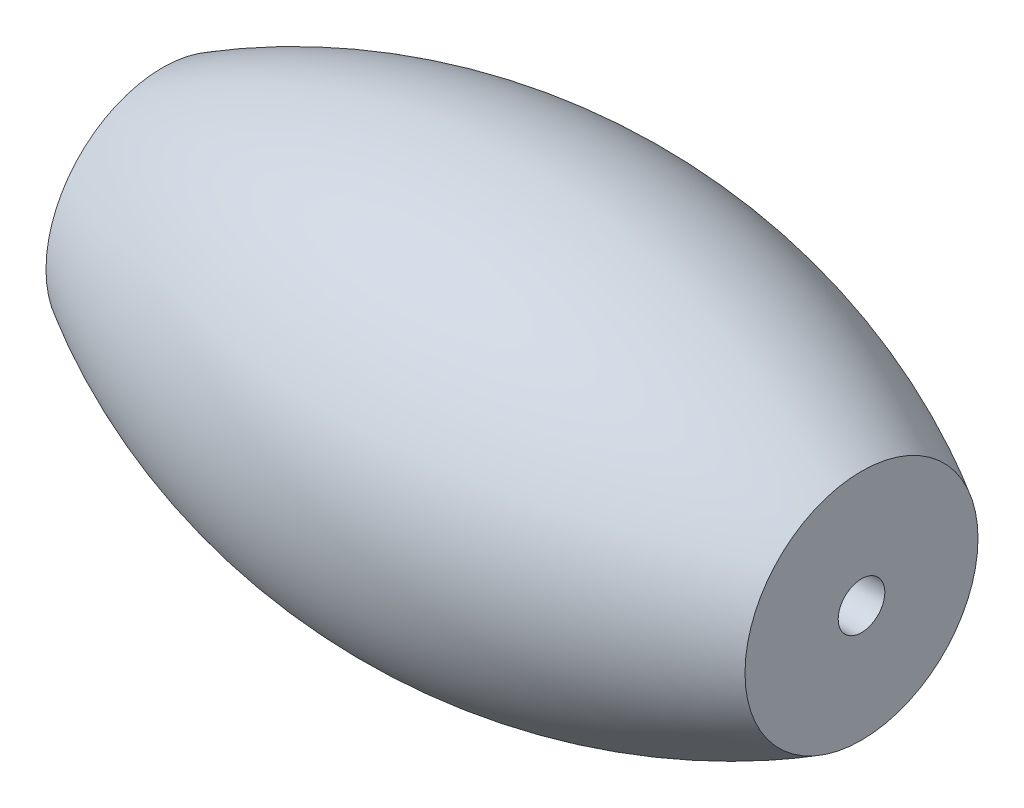
ISO-10303-21;
HEADER;
FILE_DESCRIPTION(('STEP AP214'),'2;1');
FILE_NAME('part.step','',(''),(''),'','','');
FILE_SCHEMA(('AUTOMOTIVE_DESIGN { 1 0 10303 214 1 1 1 1 }'));
ENDSEC;
DATA;
#1=APPLICATION_CONTEXT('core data for automotive mechanical design processes');
#2=APPLICATION_PROTOCOL_DEFINITION('international standard','automotive_design',2000,#1);
#3=PRODUCT_CONTEXT('',#1,'mechanical');
#4=PRODUCT('Part','Part','',(#3));
#5=PRODUCT_RELATED_PRODUCT_CATEGORY('part','',(#4));
#6=PRODUCT_DEFINITION_FORMATION('','',#4);
#7=PRODUCT_DEFINITION_CONTEXT('part definition',#1,'design');
#8=PRODUCT_DEFINITION('design','',#6,#7);
#9=PRODUCT_DEFINITION_SHAPE('','',#8);
#10=(LENGTH_UNIT() NAMED_UNIT(*) SI_UNIT(.MILLI.,.METRE.));
#11=(NAMED_UNIT(*) PLANE_ANGLE_UNIT() SI_UNIT($,.RADIAN.));
#12=(NAMED_UNIT(*) SI_UNIT($,.STERADIAN.) SOLID_ANGLE_UNIT());
#13=UNCERTAINTY_MEASURE_WITH_UNIT(LENGTH_MEASURE(1.E-05),#10,'distance_accuracy_value','');
#14=(GEOMETRIC_REPRESENTATION_CONTEXT(3) GLOBAL_UNCERTAINTY_ASSIGNED_CONTEXT((#13)) GLOBAL_UNIT_ASSIGNED_CONTEXT((#10,
#11,#12)) REPRESENTATION_CONTEXT('',''));
#15=CARTESIAN_POINT('',(0.,0.,0.));
#16=DIRECTION('',(0.,0.,1.));
#17=DIRECTION('',(1.,0.,0.));
#18=AXIS2_PLACEMENT_3D('',#15,#16,#17);
#19=CARTESIAN_POINT('',(0.,0.,0.));
#20=DIRECTION('',(-1.,0.,0.));
#21=DIRECTION('',(0.,0.,1.));
#22=AXIS2_PLACEMENT_3D('',#19,#20,#21);
#23=DEGENERATE_TOROIDAL_SURFACE('',#22,20.9807621135332,30.,.F.);
#24=CARTESIAN_POINT('',(14.9999999999999,0.,0.));
#25=DIRECTION('',(-1.,0.,0.));
#26=DIRECTION('',(0.,0.,1.));
#27=AXIS2_PLACEMENT_3D('',#24,#25,#26);
#28=CIRCLE('',#27,5.);
#29=CARTESIAN_POINT('',(14.9999999999999,0.,5.));
#30=VERTEX_POINT('',#29);
#31=EDGE_CURVE('E42',#30,#30,#28,.T.);
#32=ORIENTED_EDGE('',*,*,#31,.T.);
#33=EDGE_LOOP('',(#32));
#34=FACE_BOUND('',#33,.T.);
#35=CARTESIAN_POINT('',(-14.9999999999999,0.,0.));
#36=DIRECTION('',(-1.,0.,0.));
#37=DIRECTION('',(0.,0.,1.));
#38=AXIS2_PLACEMENT_3D('',#35,#36,#37);
#39=CIRCLE('',#38,5.);
#40=CARTESIAN_POINT('',(-14.9999999999999,0.,5.));
#41=VERTEX_POINT('',#40);
#42=EDGE_CURVE('E10',#41,#41,#39,.T.);
#43=ORIENTED_EDGE('',*,*,#42,.F.);
#44=EDGE_LOOP('',(#43));
#45=FACE_BOUND('',#44,.T.);
#46=ADVANCED_FACE('F28',(#34,#45),#23,.F.);
#47=CARTESIAN_POINT('',(-14.9999999999999,0.,-4.5096189432334));
#48=DIRECTION('',(-1.,0.,0.));
#49=DIRECTION('',(0.,0.,1.));
#50=AXIS2_PLACEMENT_3D('',#47,#48,#49);
#51=PLANE('',#50);
#52=ORIENTED_EDGE('',*,*,#42,.T.);
#53=EDGE_LOOP('',(#52));
#54=FACE_BOUND('',#53,.T.);
#55=CARTESIAN_POINT('',(-14.9999999999999,0.,0.));
#56=DIRECTION('',(-1.,0.,0.));
#57=DIRECTION('',(0.,0.,1.));
#58=AXIS2_PLACEMENT_3D('',#55,#56,#57);
#59=CIRCLE('',#58,1.);
#60=CARTESIAN_POINT('',(-14.9999999999999,0.,1.));
#61=VERTEX_POINT('',#60);
#62=EDGE_CURVE('E34',#61,#61,#59,.T.);
#63=ORIENTED_EDGE('',*,*,#62,.F.);
#64=EDGE_LOOP('',(#63));
#65=FACE_BOUND('',#64,.T.);
#66=ADVANCED_FACE('F58',(#54,#65),#51,.T.);
#67=CARTESIAN_POINT('',(-14.9999999999999,0.,0.));
#68=DIRECTION('',(-1.,0.,0.));
#69=DIRECTION('',(0.,0.,1.));
#70=AXIS2_PLACEMENT_3D('',#67,#68,#69);
#71=CYLINDRICAL_SURFACE('',#70,1.);
#72=CARTESIAN_POINT('',(14.9999999999999,0.,0.));
#73=DIRECTION('',(-1.,0.,0.));
#74=DIRECTION('',(0.,0.,1.));
#75=AXIS2_PLACEMENT_3D('',#72,#73,#74);
#76=CIRCLE('',#75,1.);
#77=CARTESIAN_POINT('',(14.9999999999999,0.,1.));
#78=VERTEX_POINT('',#77);
#79=EDGE_CURVE('E38',#78,#78,#76,.T.);
#80=ORIENTED_EDGE('',*,*,#79,.F.);
#81=EDGE_LOOP('',(#80));
#82=FACE_BOUND('',#81,.T.);
#83=ORIENTED_EDGE('',*,*,#62,.T.);
#84=EDGE_LOOP('',(#83));
#85=FACE_BOUND('',#84,.T.);
#86=ADVANCED_FACE('F52',(#82,#85),#71,.F.);
#87=CARTESIAN_POINT('',(14.9999999999999,0.,-4.5096189432334));
#88=DIRECTION('',(1.,0.,0.));
#89=DIRECTION('',(0.,0.,-1.));
#90=AXIS2_PLACEMENT_3D('',#87,#88,#89);
#91=PLANE('',#90);
#92=ORIENTED_EDGE('',*,*,#79,.T.);
#93=EDGE_LOOP('',(#92));
#94=FACE_BOUND('',#93,.T.);
#95=ORIENTED_EDGE('',*,*,#31,.F.);
#96=EDGE_LOOP('',(#95));
#97=FACE_BOUND('',#96,.T.);
#98=ADVANCED_FACE('F50',(#94,#97),#91,.T.);
#99=CLOSED_SHELL('',(#46,#66,#86,#98));
#100=MANIFOLD_SOLID_BREP('B2',#99);
#101=ADVANCED_BREP_SHAPE_REPRESENTATION('',(#18,#100),#14);
#102=SHAPE_DEFINITION_REPRESENTATION(#9,#101);
ENDSEC;
END-ISO-10303-21;
